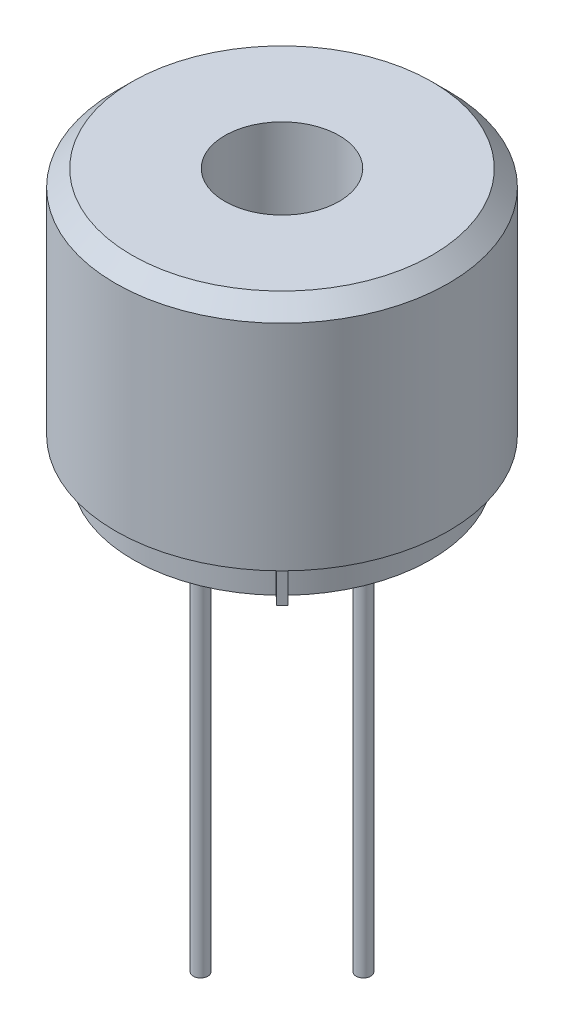
ISO-10303-21;
HEADER;
FILE_DESCRIPTION(('STEP AP214'),'2;1');
FILE_NAME('part.step','',(''),(''),'','','');
FILE_SCHEMA(('AUTOMOTIVE_DESIGN { 1 0 10303 214 1 1 1 1 }'));
ENDSEC;
DATA;
#1=APPLICATION_CONTEXT('core data for automotive mechanical design processes');
#2=APPLICATION_PROTOCOL_DEFINITION('international standard','automotive_design',2000,#1);
#3=PRODUCT_CONTEXT('',#1,'mechanical');
#4=PRODUCT('Part','Part','',(#3));
#5=PRODUCT_RELATED_PRODUCT_CATEGORY('part','',(#4));
#6=PRODUCT_DEFINITION_FORMATION('','',#4);
#7=PRODUCT_DEFINITION_CONTEXT('part definition',#1,'design');
#8=PRODUCT_DEFINITION('design','',#6,#7);
#9=PRODUCT_DEFINITION_SHAPE('','',#8);
#10=(LENGTH_UNIT() NAMED_UNIT(*) SI_UNIT(.MILLI.,.METRE.));
#11=(NAMED_UNIT(*) PLANE_ANGLE_UNIT() SI_UNIT($,.RADIAN.));
#12=(NAMED_UNIT(*) SI_UNIT($,.STERADIAN.) SOLID_ANGLE_UNIT());
#13=UNCERTAINTY_MEASURE_WITH_UNIT(LENGTH_MEASURE(1.E-05),#10,'distance_accuracy_value','');
#14=(GEOMETRIC_REPRESENTATION_CONTEXT(3) GLOBAL_UNCERTAINTY_ASSIGNED_CONTEXT((#13)) GLOBAL_UNIT_ASSIGNED_CONTEXT((#10,
#11,#12)) REPRESENTATION_CONTEXT('',''));
#15=CARTESIAN_POINT('',(0.,0.,0.));
#16=DIRECTION('',(0.,0.,1.));
#17=DIRECTION('',(1.,0.,0.));
#18=AXIS2_PLACEMENT_3D('',#15,#16,#17);
#19=CARTESIAN_POINT('',(0.,-7.07,0.));
#20=DIRECTION('',(0.,1.,0.));
#21=DIRECTION('',(0.,0.,1.));
#22=AXIS2_PLACEMENT_3D('',#19,#20,#21);
#23=CYLINDRICAL_SURFACE('',#22,5.1);
#24=CARTESIAN_POINT('',(0.,-0.5,0.));
#25=DIRECTION('',(0.,1.,0.));
#26=DIRECTION('',(0.,0.,1.));
#27=AXIS2_PLACEMENT_3D('',#24,#25,#26);
#28=CIRCLE('',#27,5.1);
#29=CARTESIAN_POINT('',(0.,-0.500000000000001,5.1));
#30=VERTEX_POINT('',#29);
#31=EDGE_CURVE('E62',#30,#30,#28,.F.);
#32=CARTESIAN_POINT('',(0.,-7.07,0.));
#33=DIRECTION('',(0.,1.,0.));
#34=DIRECTION('',(0.,0.,1.));
#35=AXIS2_PLACEMENT_3D('',#32,#33,#34);
#36=CIRCLE('',#35,5.1);
#37=CARTESIAN_POINT('',(0.,-7.07,5.1));
#38=VERTEX_POINT('',#37);
#39=EDGE_CURVE('E171',#38,#38,#36,.T.);
#40=CARTESIAN_POINT('',(0.,-0.500000000000001,5.1));
#41=CARTESIAN_POINT('',(0.,-0.568437500000001,5.1));
#42=CARTESIAN_POINT('',(0.,-0.636875000000001,5.1));
#43=CARTESIAN_POINT('',(0.,-0.773750000000001,5.1));
#44=CARTESIAN_POINT('',(0.,-0.842187500000002,5.1));
#45=CARTESIAN_POINT('',(0.,-0.979062500000002,5.1));
#46=CARTESIAN_POINT('',(0.,-1.0475,5.1));
#47=CARTESIAN_POINT('',(0.,-1.184375,5.1));
#48=CARTESIAN_POINT('',(0.,-1.2528125,5.1));
#49=CARTESIAN_POINT('',(0.,-1.3896875,5.1));
#50=CARTESIAN_POINT('',(0.,-1.458125,5.1));
#51=CARTESIAN_POINT('',(0.,-1.595,5.1));
#52=CARTESIAN_POINT('',(0.,-1.6634375,5.1));
#53=CARTESIAN_POINT('',(0.,-1.8003125,5.1));
#54=CARTESIAN_POINT('',(0.,-1.86875,5.1));
#55=CARTESIAN_POINT('',(0.,-2.005625,5.1));
#56=CARTESIAN_POINT('',(0.,-2.0740625,5.1));
#57=CARTESIAN_POINT('',(0.,-2.2109375,5.1));
#58=CARTESIAN_POINT('',(0.,-2.279375,5.1));
#59=CARTESIAN_POINT('',(0.,-2.41625,5.1));
#60=CARTESIAN_POINT('',(0.,-2.4846875,5.1));
#61=CARTESIAN_POINT('',(0.,-2.6215625,5.1));
#62=CARTESIAN_POINT('',(0.,-2.69,5.1));
#63=CARTESIAN_POINT('',(0.,-2.826875,5.1));
#64=CARTESIAN_POINT('',(0.,-2.8953125,5.1));
#65=CARTESIAN_POINT('',(0.,-3.0321875,5.1));
#66=CARTESIAN_POINT('',(0.,-3.100625,5.1));
#67=CARTESIAN_POINT('',(0.,-3.2375,5.1));
#68=CARTESIAN_POINT('',(0.,-3.3059375,5.1));
#69=CARTESIAN_POINT('',(0.,-3.4428125,5.1));
#70=CARTESIAN_POINT('',(0.,-3.51125,5.1));
#71=CARTESIAN_POINT('',(0.,-3.648125,5.1));
#72=CARTESIAN_POINT('',(0.,-3.7165625,5.1));
#73=CARTESIAN_POINT('',(0.,-3.8534375,5.1));
#74=CARTESIAN_POINT('',(0.,-3.921875,5.1));
#75=CARTESIAN_POINT('',(0.,-4.05875,5.1));
#76=CARTESIAN_POINT('',(0.,-4.1271875,5.1));
#77=CARTESIAN_POINT('',(0.,-4.2640625,5.1));
#78=CARTESIAN_POINT('',(0.,-4.3325,5.1));
#79=CARTESIAN_POINT('',(0.,-4.469375,5.1));
#80=CARTESIAN_POINT('',(0.,-4.5378125,5.1));
#81=CARTESIAN_POINT('',(0.,-4.6746875,5.1));
#82=CARTESIAN_POINT('',(0.,-4.743125,5.1));
#83=CARTESIAN_POINT('',(0.,-4.88,5.1));
#84=CARTESIAN_POINT('',(0.,-4.9484375,5.1));
#85=CARTESIAN_POINT('',(0.,-5.0853125,5.1));
#86=CARTESIAN_POINT('',(0.,-5.15375,5.1));
#87=CARTESIAN_POINT('',(0.,-5.290625,5.1));
#88=CARTESIAN_POINT('',(0.,-5.3590625,5.1));
#89=CARTESIAN_POINT('',(0.,-5.4959375,5.1));
#90=CARTESIAN_POINT('',(0.,-5.564375,5.1));
#91=CARTESIAN_POINT('',(0.,-5.70125,5.1));
#92=CARTESIAN_POINT('',(0.,-5.7696875,5.1));
#93=CARTESIAN_POINT('',(0.,-5.9065625,5.1));
#94=CARTESIAN_POINT('',(0.,-5.975,5.1));
#95=CARTESIAN_POINT('',(0.,-6.111875,5.1));
#96=CARTESIAN_POINT('',(0.,-6.1803125,5.1));
#97=CARTESIAN_POINT('',(0.,-6.3171875,5.1));
#98=CARTESIAN_POINT('',(0.,-6.385625,5.1));
#99=CARTESIAN_POINT('',(0.,-6.5225,5.1));
#100=CARTESIAN_POINT('',(0.,-6.5909375,5.1));
#101=CARTESIAN_POINT('',(0.,-6.7278125,5.1));
#102=CARTESIAN_POINT('',(0.,-6.79625,5.1));
#103=CARTESIAN_POINT('',(0.,-6.933125,5.1));
#104=CARTESIAN_POINT('',(0.,-7.0015625,5.1));
#105=CARTESIAN_POINT('',(0.,-7.07,5.1));
#106=B_SPLINE_CURVE_WITH_KNOTS('',3,(#40,#41,#42,#43,#44,#45,#46,#47,#48,#49,#50,#51,#52,#53,
#54,#55,#56,#57,#58,#59,#60,#61,#62,#63,#64,#65,#66,#67,#68,#69,#70,#71,#72,#73,#74,#75,#76,#77,
#78,#79,#80,#81,#82,#83,#84,#85,#86,#87,#88,#89,#90,#91,#92,#93,#94,#95,#96,#97,#98,#99,#100,
#101,#102,#103,#104,#105),.UNSPECIFIED.,.F.,.F.,(4,2,2,2,2,2,2,2,2,2,2,2,2,2,2,2,2,2,2,2,2,2,2,
2,2,2,2,2,2,2,2,2,4),(0.,0.2053125,0.410625,0.6159375,0.82125,1.0265625,1.231875,1.4371875,
1.6425,1.8478125,2.053125,2.2584375,2.46375,2.6690625,2.874375,3.0796875,3.285,3.4903125,
3.695625,3.9009375,4.10625,4.3115625,4.516875,4.7221875,4.9275,5.1328125,5.338125,5.5434375,
5.74875,5.9540625,6.159375,6.3646875,6.57),.UNSPECIFIED.);
#107=EDGE_CURVE('BSEAM53',#30,#38,#106,.T.);
#108=ORIENTED_EDGE('',*,*,#31,.T.);
#109=ORIENTED_EDGE('',*,*,#39,.T.);
#110=ORIENTED_EDGE('',*,*,#107,.T.);
#111=ORIENTED_EDGE('',*,*,#107,.F.);
#112=EDGE_LOOP('',(#108,#110,#109,#111));
#113=FACE_BOUND('',#112,.T.);
#114=ADVANCED_FACE('F53',(#113),#23,.T.);
#115=CARTESIAN_POINT('',(0.,-7.07,0.));
#116=DIRECTION('',(0.,1.,0.));
#117=DIRECTION('',(0.,0.,1.));
#118=AXIS2_PLACEMENT_3D('',#115,#116,#117);
#119=PLANE('',#118);
#120=DIRECTION('',(0.693252976854918,0.,-0.720694324996246));
#121=VECTOR('',#120,1.);
#122=CARTESIAN_POINT('',(3.56086986068658,-7.07,3.42528523604898));
#123=LINE('',#122,#121);
#124=CARTESIAN_POINT('',(3.41228418067474,-7.07,3.57975245066672));
#125=VERTEX_POINT('',#124);
#126=CARTESIAN_POINT('',(3.58677461982361,-7.07,3.39835507703955));
#127=VERTEX_POINT('',#126);
#128=EDGE_CURVE('E110',#125,#127,#123,.T.);
#129=ORIENTED_EDGE('',*,*,#128,.T.);
#130=DIRECTION('',(0.720694324996246,0.,0.693252976854918));
#131=VECTOR('',#130,1.);
#132=CARTESIAN_POINT('',(0.0259047591370399,-7.07,-0.0269301590094238));
#133=LINE('',#132,#131);
#134=CARTESIAN_POINT('',(3.31216053954314,-7.07,3.13419727526735));
#135=VERTEX_POINT('',#134);
#136=EDGE_CURVE('E96',#135,#127,#133,.T.);
#137=ORIENTED_EDGE('',*,*,#136,.F.);
#138=CARTESIAN_POINT('',(0.,-7.07,0.));
#139=DIRECTION('',(0.,-1.,0.));
#140=DIRECTION('',(0.,0.,-1.));
#141=AXIS2_PLACEMENT_3D('',#138,#139,#140);
#142=CIRCLE('',#141,4.56);
#143=CARTESIAN_POINT('',(3.13414826707024,-7.07,3.3122069138296));
#144=VERTEX_POINT('',#143);
#145=EDGE_CURVE('E14',#144,#135,#142,.T.);
#146=ORIENTED_EDGE('',*,*,#145,.F.);
#147=DIRECTION('',(0.720694324996246,0.,0.693252976854918));
#148=VECTOR('',#147,1.);
#149=CARTESIAN_POINT('',(-0.148585680011836,-7.07,0.154467214617744));
#150=LINE('',#149,#148);
#151=EDGE_CURVE('E116',#144,#125,#150,.T.);
#152=ORIENTED_EDGE('',*,*,#151,.T.);
#153=EDGE_LOOP('',(#129,#137,#146,#152));
#154=FACE_BOUND('',#153,.T.);
#155=ORIENTED_EDGE('',*,*,#39,.F.);
#156=EDGE_LOOP('',(#155));
#157=FACE_BOUND('',#156,.T.);
#158=ADVANCED_FACE('F114',(#154,#157),#119,.F.);
#159=CARTESIAN_POINT('',(0.,0.,0.));
#160=DIRECTION('',(0.,1.,0.));
#161=DIRECTION('',(0.,0.,1.));
#162=AXIS2_PLACEMENT_3D('',#159,#160,#161);
#163=PLANE('',#162);
#164=CARTESIAN_POINT('',(0.,0.,0.));
#165=DIRECTION('',(0.,1.,0.));
#166=DIRECTION('',(0.,0.,1.));
#167=AXIS2_PLACEMENT_3D('',#164,#165,#166);
#168=CIRCLE('',#167,4.6);
#169=CARTESIAN_POINT('',(0.,0.,4.6));
#170=VERTEX_POINT('',#169);
#171=EDGE_CURVE('E174',#170,#170,#168,.T.);
#172=ORIENTED_EDGE('',*,*,#171,.T.);
#173=EDGE_LOOP('',(#172));
#174=FACE_BOUND('',#173,.T.);
#175=CARTESIAN_POINT('',(0.,0.,0.));
#176=DIRECTION('',(0.,1.,0.));
#177=DIRECTION('',(0.,0.,1.));
#178=AXIS2_PLACEMENT_3D('',#175,#176,#177);
#179=CIRCLE('',#178,1.75);
#180=CARTESIAN_POINT('',(0.,0.,1.75));
#181=VERTEX_POINT('',#180);
#182=EDGE_CURVE('E158',#181,#181,#179,.T.);
#183=ORIENTED_EDGE('',*,*,#182,.F.);
#184=EDGE_LOOP('',(#183));
#185=FACE_BOUND('',#184,.T.);
#186=ADVANCED_FACE('F218',(#174,#185),#163,.T.);
#187=CARTESIAN_POINT('',(0.,-4.,0.));
#188=DIRECTION('',(0.,1.,0.));
#189=DIRECTION('',(0.,0.,1.));
#190=AXIS2_PLACEMENT_3D('',#187,#188,#189);
#191=CYLINDRICAL_SURFACE('',#190,1.75);
#192=CARTESIAN_POINT('',(0.,-4.,0.));
#193=DIRECTION('',(0.,1.,0.));
#194=DIRECTION('',(0.,0.,1.));
#195=AXIS2_PLACEMENT_3D('',#192,#193,#194);
#196=CIRCLE('',#195,1.75);
#197=CARTESIAN_POINT('',(0.,-4.,1.75));
#198=VERTEX_POINT('',#197);
#199=EDGE_CURVE('E163',#198,#198,#196,.T.);
#200=ORIENTED_EDGE('',*,*,#199,.F.);
#201=EDGE_LOOP('',(#200));
#202=FACE_BOUND('',#201,.T.);
#203=ORIENTED_EDGE('',*,*,#182,.T.);
#204=EDGE_LOOP('',(#203));
#205=FACE_BOUND('',#204,.T.);
#206=ADVANCED_FACE('F223',(#202,#205),#191,.F.);
#207=CARTESIAN_POINT('',(0.,-4.,0.));
#208=DIRECTION('',(0.,1.,0.));
#209=DIRECTION('',(0.,0.,1.));
#210=AXIS2_PLACEMENT_3D('',#207,#208,#209);
#211=PLANE('',#210);
#212=CARTESIAN_POINT('',(0.,-4.,0.));
#213=DIRECTION('',(0.,1.,0.));
#214=DIRECTION('',(0.,0.,1.));
#215=AXIS2_PLACEMENT_3D('',#212,#213,#214);
#216=CIRCLE('',#215,0.75);
#217=CARTESIAN_POINT('',(0.,-4.,0.75));
#218=VERTEX_POINT('',#217);
#219=EDGE_CURVE('E160',#218,#218,#216,.T.);
#220=ORIENTED_EDGE('',*,*,#219,.F.);
#221=EDGE_LOOP('',(#220));
#222=FACE_BOUND('',#221,.T.);
#223=ORIENTED_EDGE('',*,*,#199,.T.);
#224=EDGE_LOOP('',(#223));
#225=FACE_BOUND('',#224,.T.);
#226=ADVANCED_FACE('F233',(#222,#225),#211,.T.);
#227=CARTESIAN_POINT('',(0.,-5.74,0.));
#228=DIRECTION('',(0.,1.,0.));
#229=DIRECTION('',(0.,0.,1.));
#230=AXIS2_PLACEMENT_3D('',#227,#228,#229);
#231=PLANE('',#230);
#232=CARTESIAN_POINT('',(0.,-5.74,0.));
#233=DIRECTION('',(0.,1.,0.));
#234=DIRECTION('',(0.,0.,1.));
#235=AXIS2_PLACEMENT_3D('',#232,#233,#234);
#236=CIRCLE('',#235,0.75);
#237=CARTESIAN_POINT('',(0.,-5.74,0.75));
#238=VERTEX_POINT('',#237);
#239=EDGE_CURVE('E166',#238,#238,#236,.T.);
#240=ORIENTED_EDGE('',*,*,#239,.T.);
#241=EDGE_LOOP('',(#240));
#242=FACE_BOUND('',#241,.T.);
#243=ADVANCED_FACE('F229',(#242),#231,.T.);
#244=CARTESIAN_POINT('',(0.,-5.74,0.));
#245=DIRECTION('',(0.,1.,0.));
#246=DIRECTION('',(0.,0.,1.));
#247=AXIS2_PLACEMENT_3D('',#244,#245,#246);
#248=CYLINDRICAL_SURFACE('',#247,0.75);
#249=ORIENTED_EDGE('',*,*,#239,.F.);
#250=EDGE_LOOP('',(#249));
#251=FACE_BOUND('',#250,.T.);
#252=ORIENTED_EDGE('',*,*,#219,.T.);
#253=EDGE_LOOP('',(#252));
#254=FACE_BOUND('',#253,.T.);
#255=ADVANCED_FACE('F226',(#251,#254),#248,.F.);
#256=CARTESIAN_POINT('',(0.,0.,0.));
#257=DIRECTION('',(0.,-1.,0.));
#258=DIRECTION('',(0.,0.,-1.));
#259=AXIS2_PLACEMENT_3D('',#256,#257,#258);
#260=CONICAL_SURFACE('',#259,4.6,0.785398163397445);
#261=ORIENTED_EDGE('',*,*,#31,.F.);
#262=EDGE_LOOP('',(#261));
#263=FACE_BOUND('',#262,.T.);
#264=ORIENTED_EDGE('',*,*,#171,.F.);
#265=EDGE_LOOP('',(#264));
#266=FACE_BOUND('',#265,.T.);
#267=ADVANCED_FACE('F55',(#263,#266),#260,.T.);
#268=CARTESIAN_POINT('',(0.,-8.1,0.));
#269=DIRECTION('',(0.,1.,0.));
#270=DIRECTION('',(0.,0.,1.));
#271=AXIS2_PLACEMENT_3D('',#268,#269,#270);
#272=CYLINDRICAL_SURFACE('',#271,4.56);
#273=ORIENTED_EDGE('',*,*,#145,.T.);
#274=DIRECTION('',(0.,-1.,0.));
#275=VECTOR('',#274,1.);
#276=CARTESIAN_POINT('',(3.31216053954314,-6.43487006877963,3.13419727526735));
#277=LINE('',#276,#275);
#278=CARTESIAN_POINT('',(3.31216053954314,-8.1,3.13419727526735));
#279=VERTEX_POINT('',#278);
#280=EDGE_CURVE('E102',#135,#279,#277,.T.);
#281=ORIENTED_EDGE('',*,*,#280,.T.);
#282=CARTESIAN_POINT('',(0.,-8.1,0.));
#283=DIRECTION('',(0.,-1.,0.));
#284=DIRECTION('',(0.,0.,-1.));
#285=AXIS2_PLACEMENT_3D('',#282,#283,#284);
#286=CIRCLE('',#285,4.56);
#287=CARTESIAN_POINT('',(3.13414826707024,-8.1,3.3122069138296));
#288=VERTEX_POINT('',#287);
#289=EDGE_CURVE('E157',#288,#279,#286,.T.);
#290=ORIENTED_EDGE('',*,*,#289,.F.);
#291=DIRECTION('',(0.,-1.,0.));
#292=VECTOR('',#291,1.);
#293=CARTESIAN_POINT('',(3.13414826707024,-6.43487006877963,3.3122069138296));
#294=LINE('',#293,#292);
#295=EDGE_CURVE('E126',#144,#288,#294,.T.);
#296=ORIENTED_EDGE('',*,*,#295,.F.);
#297=EDGE_LOOP('',(#273,#281,#290,#296));
#298=FACE_BOUND('',#297,.T.);
#299=ADVANCED_FACE('F241',(#298),#272,.T.);
#300=CARTESIAN_POINT('',(0.,-8.1,0.));
#301=DIRECTION('',(0.,-1.,0.));
#302=DIRECTION('',(0.,0.,-1.));
#303=AXIS2_PLACEMENT_3D('',#300,#301,#302);
#304=PLANE('',#303);
#305=CARTESIAN_POINT('',(-2.49463280478679,-8.1,0.));
#306=DIRECTION('',(0.,-1.,0.));
#307=DIRECTION('',(0.,0.,-1.));
#308=AXIS2_PLACEMENT_3D('',#305,#306,#307);
#309=CIRCLE('',#308,0.8);
#310=CARTESIAN_POINT('',(-2.49463280478679,-8.1,-0.799999999999974));
#311=VERTEX_POINT('',#310);
#312=EDGE_CURVE('E144',#311,#311,#309,.F.);
#313=ORIENTED_EDGE('',*,*,#312,.T.);
#314=EDGE_LOOP('',(#313));
#315=FACE_BOUND('',#314,.T.);
#316=CARTESIAN_POINT('',(0.,-8.1,-2.49463280478679));
#317=DIRECTION('',(0.,-1.,0.));
#318=DIRECTION('',(0.,0.,-1.));
#319=AXIS2_PLACEMENT_3D('',#316,#317,#318);
#320=CIRCLE('',#319,0.8);
#321=CARTESIAN_POINT('',(0.,-8.1,-3.29463280478679));
#322=VERTEX_POINT('',#321);
#323=EDGE_CURVE('E148',#322,#322,#320,.F.);
#324=ORIENTED_EDGE('',*,*,#323,.T.);
#325=EDGE_LOOP('',(#324));
#326=FACE_BOUND('',#325,.T.);
#327=CARTESIAN_POINT('',(2.49463280478679,-8.1,0.));
#328=DIRECTION('',(0.,-1.,0.));
#329=DIRECTION('',(0.,0.,-1.));
#330=AXIS2_PLACEMENT_3D('',#327,#328,#329);
#331=CIRCLE('',#330,0.8);
#332=CARTESIAN_POINT('',(2.49463280478679,-8.1,-0.800000000000009));
#333=VERTEX_POINT('',#332);
#334=EDGE_CURVE('E152',#333,#333,#331,.F.);
#335=ORIENTED_EDGE('',*,*,#334,.T.);
#336=EDGE_LOOP('',(#335));
#337=FACE_BOUND('',#336,.T.);
#338=CARTESIAN_POINT('',(0.,-8.1,2.49463280478679));
#339=DIRECTION('',(0.,-1.,0.));
#340=DIRECTION('',(0.,0.,-1.));
#341=AXIS2_PLACEMENT_3D('',#338,#339,#340);
#342=CIRCLE('',#341,0.8);
#343=CARTESIAN_POINT('',(0.,-8.1,1.69463280478679));
#344=VERTEX_POINT('',#343);
#345=EDGE_CURVE('E156',#344,#344,#342,.F.);
#346=ORIENTED_EDGE('',*,*,#345,.T.);
#347=EDGE_LOOP('',(#346));
#348=FACE_BOUND('',#347,.T.);
#349=ORIENTED_EDGE('',*,*,#289,.T.);
#350=DIRECTION('',(0.720694324996246,0.,0.693252976854918));
#351=VECTOR('',#350,1.);
#352=CARTESIAN_POINT('',(0.0259047591370399,-8.1,-0.0269301590094238));
#353=LINE('',#352,#351);
#354=CARTESIAN_POINT('',(3.58677461982361,-8.1,3.39835507703955));
#355=VERTEX_POINT('',#354);
#356=EDGE_CURVE('E121',#279,#355,#353,.T.);
#357=ORIENTED_EDGE('',*,*,#356,.T.);
#358=DIRECTION('',(0.693252976854918,0.,-0.720694324996246));
#359=VECTOR('',#358,1.);
#360=CARTESIAN_POINT('',(3.56086986068658,-8.1,3.42528523604898));
#361=LINE('',#360,#359);
#362=CARTESIAN_POINT('',(3.41228418067474,-8.1,3.57975245066672));
#363=VERTEX_POINT('',#362);
#364=EDGE_CURVE('E106',#363,#355,#361,.T.);
#365=ORIENTED_EDGE('',*,*,#364,.F.);
#366=DIRECTION('',(0.720694324996246,0.,0.693252976854918));
#367=VECTOR('',#366,1.);
#368=CARTESIAN_POINT('',(-0.148585680011836,-8.1,0.154467214617744));
#369=LINE('',#368,#367);
#370=EDGE_CURVE('E70',#288,#363,#369,.T.);
#371=ORIENTED_EDGE('',*,*,#370,.F.);
#372=EDGE_LOOP('',(#349,#357,#365,#371));
#373=FACE_BOUND('',#372,.T.);
#374=ADVANCED_FACE('F244',(#315,#326,#337,#348,#373),#304,.T.);
#375=CARTESIAN_POINT('',(0.,-8.17,2.49463280478679));
#376=DIRECTION('',(0.,1.,0.));
#377=DIRECTION('',(0.,0.,1.));
#378=AXIS2_PLACEMENT_3D('',#375,#376,#377);
#379=CYLINDRICAL_SURFACE('',#378,0.8);
#380=ORIENTED_EDGE('',*,*,#345,.F.);
#381=EDGE_LOOP('',(#380));
#382=FACE_BOUND('',#381,.T.);
#383=CARTESIAN_POINT('',(0.,-8.17,2.49463280478679));
#384=DIRECTION('',(0.,-1.,0.));
#385=DIRECTION('',(0.,0.,-1.));
#386=AXIS2_PLACEMENT_3D('',#383,#384,#385);
#387=CIRCLE('',#386,0.8);
#388=CARTESIAN_POINT('',(0.,-8.17,1.69463280478679));
#389=VERTEX_POINT('',#388);
#390=EDGE_CURVE('E153',#389,#389,#387,.T.);
#391=ORIENTED_EDGE('',*,*,#390,.F.);
#392=EDGE_LOOP('',(#391));
#393=FACE_BOUND('',#392,.T.);
#394=ADVANCED_FACE('F248',(#382,#393),#379,.T.);
#395=CARTESIAN_POINT('',(0.,-8.17,0.));
#396=DIRECTION('',(0.,-1.,0.));
#397=DIRECTION('',(0.,0.,-1.));
#398=AXIS2_PLACEMENT_3D('',#395,#396,#397);
#399=PLANE('',#398);
#400=CARTESIAN_POINT('',(0.,-8.17,2.49463280478679));
#401=DIRECTION('',(0.,-1.,0.));
#402=DIRECTION('',(0.,0.,-1.));
#403=AXIS2_PLACEMENT_3D('',#400,#401,#402);
#404=CIRCLE('',#403,0.225);
#405=CARTESIAN_POINT('',(0.,-8.17,2.26963280478679));
#406=VERTEX_POINT('',#405);
#407=EDGE_CURVE('E136',#406,#406,#404,.F.);
#408=ORIENTED_EDGE('',*,*,#407,.T.);
#409=EDGE_LOOP('',(#408));
#410=FACE_BOUND('',#409,.T.);
#411=ORIENTED_EDGE('',*,*,#390,.T.);
#412=EDGE_LOOP('',(#411));
#413=FACE_BOUND('',#412,.T.);
#414=ADVANCED_FACE('F252',(#410,#413),#399,.T.);
#415=CARTESIAN_POINT('',(2.49463280478679,-8.17,0.));
#416=DIRECTION('',(0.,1.,0.));
#417=DIRECTION('',(0.,0.,1.));
#418=AXIS2_PLACEMENT_3D('',#415,#416,#417);
#419=CYLINDRICAL_SURFACE('',#418,0.8);
#420=ORIENTED_EDGE('',*,*,#334,.F.);
#421=EDGE_LOOP('',(#420));
#422=FACE_BOUND('',#421,.T.);
#423=CARTESIAN_POINT('',(2.49463280478679,-8.17,0.));
#424=DIRECTION('',(0.,-1.,0.));
#425=DIRECTION('',(0.,0.,-1.));
#426=AXIS2_PLACEMENT_3D('',#423,#424,#425);
#427=CIRCLE('',#426,0.8);
#428=CARTESIAN_POINT('',(2.49463280478679,-8.17,-0.800000000000009));
#429=VERTEX_POINT('',#428);
#430=EDGE_CURVE('E149',#429,#429,#427,.T.);
#431=ORIENTED_EDGE('',*,*,#430,.F.);
#432=EDGE_LOOP('',(#431));
#433=FACE_BOUND('',#432,.T.);
#434=ADVANCED_FACE('F256',(#422,#433),#419,.T.);
#435=CARTESIAN_POINT('',(0.,-8.17,0.));
#436=DIRECTION('',(0.,-1.,0.));
#437=DIRECTION('',(0.,0.,-1.));
#438=AXIS2_PLACEMENT_3D('',#435,#436,#437);
#439=PLANE('',#438);
#440=CARTESIAN_POINT('',(2.49463280478679,-8.17,0.));
#441=DIRECTION('',(0.,-1.,0.));
#442=DIRECTION('',(0.,0.,-1.));
#443=AXIS2_PLACEMENT_3D('',#440,#441,#442);
#444=CIRCLE('',#443,0.225);
#445=CARTESIAN_POINT('',(2.49463280478679,-8.17,-0.225000000000009));
#446=VERTEX_POINT('',#445);
#447=EDGE_CURVE('E132',#446,#446,#444,.F.);
#448=ORIENTED_EDGE('',*,*,#447,.T.);
#449=EDGE_LOOP('',(#448));
#450=FACE_BOUND('',#449,.T.);
#451=ORIENTED_EDGE('',*,*,#430,.T.);
#452=EDGE_LOOP('',(#451));
#453=FACE_BOUND('',#452,.T.);
#454=ADVANCED_FACE('F193',(#450,#453),#439,.T.);
#455=CARTESIAN_POINT('',(0.,-8.17,-2.49463280478679));
#456=DIRECTION('',(0.,1.,0.));
#457=DIRECTION('',(0.,0.,1.));
#458=AXIS2_PLACEMENT_3D('',#455,#456,#457);
#459=CYLINDRICAL_SURFACE('',#458,0.8);
#460=ORIENTED_EDGE('',*,*,#323,.F.);
#461=EDGE_LOOP('',(#460));
#462=FACE_BOUND('',#461,.T.);
#463=CARTESIAN_POINT('',(0.,-8.17,-2.49463280478679));
#464=DIRECTION('',(0.,-1.,0.));
#465=DIRECTION('',(0.,0.,-1.));
#466=AXIS2_PLACEMENT_3D('',#463,#464,#465);
#467=CIRCLE('',#466,0.8);
#468=CARTESIAN_POINT('',(0.,-8.17,-3.29463280478679));
#469=VERTEX_POINT('',#468);
#470=EDGE_CURVE('E145',#469,#469,#467,.T.);
#471=ORIENTED_EDGE('',*,*,#470,.F.);
#472=EDGE_LOOP('',(#471));
#473=FACE_BOUND('',#472,.T.);
#474=ADVANCED_FACE('F260',(#462,#473),#459,.T.);
#475=CARTESIAN_POINT('',(0.,-8.17,0.));
#476=DIRECTION('',(0.,-1.,0.));
#477=DIRECTION('',(0.,0.,-1.));
#478=AXIS2_PLACEMENT_3D('',#475,#476,#477);
#479=PLANE('',#478);
#480=CARTESIAN_POINT('',(0.,-8.17,-2.49463280478679));
#481=DIRECTION('',(0.,-1.,0.));
#482=DIRECTION('',(0.,0.,-1.));
#483=AXIS2_PLACEMENT_3D('',#480,#481,#482);
#484=CIRCLE('',#483,0.225);
#485=CARTESIAN_POINT('',(0.,-8.17,-2.71963280478679));
#486=VERTEX_POINT('',#485);
#487=EDGE_CURVE('E57',#486,#486,#484,.F.);
#488=ORIENTED_EDGE('',*,*,#487,.T.);
#489=EDGE_LOOP('',(#488));
#490=FACE_BOUND('',#489,.T.);
#491=ORIENTED_EDGE('',*,*,#470,.T.);
#492=EDGE_LOOP('',(#491));
#493=FACE_BOUND('',#492,.T.);
#494=ADVANCED_FACE('F264',(#490,#493),#479,.T.);
#495=CARTESIAN_POINT('',(0.,-8.17,0.));
#496=DIRECTION('',(0.,-1.,0.));
#497=DIRECTION('',(0.,0.,-1.));
#498=AXIS2_PLACEMENT_3D('',#495,#496,#497);
#499=PLANE('',#498);
#500=CARTESIAN_POINT('',(-2.49463280478679,-8.17,0.));
#501=DIRECTION('',(0.,-1.,0.));
#502=DIRECTION('',(0.,0.,-1.));
#503=AXIS2_PLACEMENT_3D('',#500,#501,#502);
#504=CIRCLE('',#503,0.225);
#505=CARTESIAN_POINT('',(-2.49463280478679,-8.17,-0.224999999999974));
#506=VERTEX_POINT('',#505);
#507=EDGE_CURVE('E140',#506,#506,#504,.F.);
#508=ORIENTED_EDGE('',*,*,#507,.T.);
#509=EDGE_LOOP('',(#508));
#510=FACE_BOUND('',#509,.T.);
#511=CARTESIAN_POINT('',(-2.49463280478679,-8.17,0.));
#512=DIRECTION('',(0.,-1.,0.));
#513=DIRECTION('',(0.,0.,-1.));
#514=AXIS2_PLACEMENT_3D('',#511,#512,#513);
#515=CIRCLE('',#514,0.8);
#516=CARTESIAN_POINT('',(-2.49463280478679,-8.17,-0.799999999999974));
#517=VERTEX_POINT('',#516);
#518=EDGE_CURVE('E141',#517,#517,#515,.T.);
#519=ORIENTED_EDGE('',*,*,#518,.T.);
#520=EDGE_LOOP('',(#519));
#521=FACE_BOUND('',#520,.T.);
#522=ADVANCED_FACE('F267',(#510,#521),#499,.T.);
#523=CARTESIAN_POINT('',(-2.49463280478679,-8.17,0.));
#524=DIRECTION('',(0.,1.,0.));
#525=DIRECTION('',(0.,0.,1.));
#526=AXIS2_PLACEMENT_3D('',#523,#524,#525);
#527=CYLINDRICAL_SURFACE('',#526,0.8);
#528=ORIENTED_EDGE('',*,*,#312,.F.);
#529=EDGE_LOOP('',(#528));
#530=FACE_BOUND('',#529,.T.);
#531=ORIENTED_EDGE('',*,*,#518,.F.);
#532=EDGE_LOOP('',(#531));
#533=FACE_BOUND('',#532,.T.);
#534=ADVANCED_FACE('F269',(#530,#533),#527,.T.);
#535=CARTESIAN_POINT('',(-2.49463280478679,-20.07,0.));
#536=DIRECTION('',(0.,1.,0.));
#537=DIRECTION('',(0.,0.,1.));
#538=AXIS2_PLACEMENT_3D('',#535,#536,#537);
#539=CYLINDRICAL_SURFACE('',#538,0.225);
#540=ORIENTED_EDGE('',*,*,#507,.F.);
#541=EDGE_LOOP('',(#540));
#542=FACE_BOUND('',#541,.T.);
#543=CARTESIAN_POINT('',(-2.49463280478679,-20.07,0.));
#544=DIRECTION('',(0.,-1.,0.));
#545=DIRECTION('',(0.,0.,-1.));
#546=AXIS2_PLACEMENT_3D('',#543,#544,#545);
#547=CIRCLE('',#546,0.225);
#548=CARTESIAN_POINT('',(-2.49463280478679,-20.07,-0.224999999999974));
#549=VERTEX_POINT('',#548);
#550=EDGE_CURVE('E137',#549,#549,#547,.T.);
#551=ORIENTED_EDGE('',*,*,#550,.F.);
#552=EDGE_LOOP('',(#551));
#553=FACE_BOUND('',#552,.T.);
#554=ADVANCED_FACE('F276',(#542,#553),#539,.T.);
#555=CARTESIAN_POINT('',(0.,-20.07,0.));
#556=DIRECTION('',(0.,-1.,0.));
#557=DIRECTION('',(0.,0.,-1.));
#558=AXIS2_PLACEMENT_3D('',#555,#556,#557);
#559=PLANE('',#558);
#560=ORIENTED_EDGE('',*,*,#550,.T.);
#561=EDGE_LOOP('',(#560));
#562=FACE_BOUND('',#561,.T.);
#563=ADVANCED_FACE('F282',(#562),#559,.T.);
#564=CARTESIAN_POINT('',(0.,-20.07,2.49463280478679));
#565=DIRECTION('',(0.,1.,0.));
#566=DIRECTION('',(0.,0.,1.));
#567=AXIS2_PLACEMENT_3D('',#564,#565,#566);
#568=CYLINDRICAL_SURFACE('',#567,0.225);
#569=ORIENTED_EDGE('',*,*,#407,.F.);
#570=EDGE_LOOP('',(#569));
#571=FACE_BOUND('',#570,.T.);
#572=CARTESIAN_POINT('',(0.,-20.07,2.49463280478679));
#573=DIRECTION('',(0.,-1.,0.));
#574=DIRECTION('',(0.,0.,-1.));
#575=AXIS2_PLACEMENT_3D('',#572,#573,#574);
#576=CIRCLE('',#575,0.225);
#577=CARTESIAN_POINT('',(0.,-20.07,2.26963280478679));
#578=VERTEX_POINT('',#577);
#579=EDGE_CURVE('E133',#578,#578,#576,.T.);
#580=ORIENTED_EDGE('',*,*,#579,.F.);
#581=EDGE_LOOP('',(#580));
#582=FACE_BOUND('',#581,.T.);
#583=ADVANCED_FACE('F286',(#571,#582),#568,.T.);
#584=CARTESIAN_POINT('',(0.,-20.07,0.));
#585=DIRECTION('',(0.,-1.,0.));
#586=DIRECTION('',(0.,0.,-1.));
#587=AXIS2_PLACEMENT_3D('',#584,#585,#586);
#588=PLANE('',#587);
#589=ORIENTED_EDGE('',*,*,#579,.T.);
#590=EDGE_LOOP('',(#589));
#591=FACE_BOUND('',#590,.T.);
#592=ADVANCED_FACE('F200',(#591),#588,.T.);
#593=CARTESIAN_POINT('',(2.49463280478679,-20.07,0.));
#594=DIRECTION('',(0.,1.,0.));
#595=DIRECTION('',(0.,0.,1.));
#596=AXIS2_PLACEMENT_3D('',#593,#594,#595);
#597=CYLINDRICAL_SURFACE('',#596,0.225);
#598=ORIENTED_EDGE('',*,*,#447,.F.);
#599=EDGE_LOOP('',(#598));
#600=FACE_BOUND('',#599,.T.);
#601=CARTESIAN_POINT('',(2.49463280478679,-20.07,0.));
#602=DIRECTION('',(0.,-1.,0.));
#603=DIRECTION('',(0.,0.,-1.));
#604=AXIS2_PLACEMENT_3D('',#601,#602,#603);
#605=CIRCLE('',#604,0.225);
#606=CARTESIAN_POINT('',(2.49463280478679,-20.07,-0.225000000000009));
#607=VERTEX_POINT('',#606);
#608=EDGE_CURVE('E129',#607,#607,#605,.T.);
#609=ORIENTED_EDGE('',*,*,#608,.F.);
#610=EDGE_LOOP('',(#609));
#611=FACE_BOUND('',#610,.T.);
#612=ADVANCED_FACE('F196',(#600,#611),#597,.T.);
#613=CARTESIAN_POINT('',(0.,-20.07,0.));
#614=DIRECTION('',(0.,-1.,0.));
#615=DIRECTION('',(0.,0.,-1.));
#616=AXIS2_PLACEMENT_3D('',#613,#614,#615);
#617=PLANE('',#616);
#618=ORIENTED_EDGE('',*,*,#608,.T.);
#619=EDGE_LOOP('',(#618));
#620=FACE_BOUND('',#619,.T.);
#621=ADVANCED_FACE('F199',(#620),#617,.T.);
#622=CARTESIAN_POINT('',(0.,-20.07,-2.49463280478679));
#623=DIRECTION('',(0.,1.,0.));
#624=DIRECTION('',(0.,0.,1.));
#625=AXIS2_PLACEMENT_3D('',#622,#623,#624);
#626=CYLINDRICAL_SURFACE('',#625,0.225);
#627=ORIENTED_EDGE('',*,*,#487,.F.);
#628=EDGE_LOOP('',(#627));
#629=FACE_BOUND('',#628,.T.);
#630=CARTESIAN_POINT('',(0.,-20.07,-2.49463280478679));
#631=DIRECTION('',(0.,-1.,0.));
#632=DIRECTION('',(0.,0.,-1.));
#633=AXIS2_PLACEMENT_3D('',#630,#631,#632);
#634=CIRCLE('',#633,0.225);
#635=CARTESIAN_POINT('',(0.,-20.07,-2.71963280478679));
#636=VERTEX_POINT('',#635);
#637=EDGE_CURVE('E117',#636,#636,#634,.T.);
#638=ORIENTED_EDGE('',*,*,#637,.F.);
#639=EDGE_LOOP('',(#638));
#640=FACE_BOUND('',#639,.T.);
#641=ADVANCED_FACE('F205',(#629,#640),#626,.T.);
#642=CARTESIAN_POINT('',(0.,-20.07,0.));
#643=DIRECTION('',(0.,-1.,0.));
#644=DIRECTION('',(0.,0.,-1.));
#645=AXIS2_PLACEMENT_3D('',#642,#643,#644);
#646=PLANE('',#645);
#647=ORIENTED_EDGE('',*,*,#637,.T.);
#648=EDGE_LOOP('',(#647));
#649=FACE_BOUND('',#648,.T.);
#650=ADVANCED_FACE('F210',(#649),#646,.T.);
#651=CARTESIAN_POINT('',(3.56086986068658,-6.43487006877963,3.42528523604898));
#652=DIRECTION('',(-0.720694324996246,0.,-0.693252976854917));
#653=DIRECTION('',(-0.693252976854918,0.,0.720694324996246));
#654=AXIS2_PLACEMENT_3D('',#651,#652,#653);
#655=PLANE('',#654);
#656=ORIENTED_EDGE('',*,*,#128,.F.);
#657=DIRECTION('',(0.,-1.,0.));
#658=VECTOR('',#657,1.);
#659=CARTESIAN_POINT('',(3.41228418067474,-6.43487006877963,3.57975245066672));
#660=LINE('',#659,#658);
#661=EDGE_CURVE('E77',#125,#363,#660,.T.);
#662=ORIENTED_EDGE('',*,*,#661,.T.);
#663=ORIENTED_EDGE('',*,*,#364,.T.);
#664=DIRECTION('',(0.,-1.,0.));
#665=VECTOR('',#664,1.);
#666=CARTESIAN_POINT('',(3.58677461982361,-6.43487006877963,3.39835507703955));
#667=LINE('',#666,#665);
#668=EDGE_CURVE('E99',#127,#355,#667,.T.);
#669=ORIENTED_EDGE('',*,*,#668,.F.);
#670=EDGE_LOOP('',(#656,#662,#663,#669));
#671=FACE_BOUND('',#670,.T.);
#672=ADVANCED_FACE('F109',(#671),#655,.F.);
#673=CARTESIAN_POINT('',(0.0259047591370399,-6.43487006877963,-0.0269301590094238));
#674=DIRECTION('',(0.693252976854918,0.,-0.720694324996246));
#675=DIRECTION('',(-0.720694324996246,0.,-0.693252976854918));
#676=AXIS2_PLACEMENT_3D('',#673,#674,#675);
#677=PLANE('',#676);
#678=ORIENTED_EDGE('',*,*,#280,.F.);
#679=ORIENTED_EDGE('',*,*,#136,.T.);
#680=ORIENTED_EDGE('',*,*,#668,.T.);
#681=ORIENTED_EDGE('',*,*,#356,.F.);
#682=EDGE_LOOP('',(#678,#679,#680,#681));
#683=FACE_BOUND('',#682,.T.);
#684=ADVANCED_FACE('F98',(#683),#677,.T.);
#685=CARTESIAN_POINT('',(-0.148585680011836,-6.43487006877963,0.154467214617744));
#686=DIRECTION('',(0.693252976854918,0.,-0.720694324996246));
#687=DIRECTION('',(-0.720694324996246,0.,-0.693252976854918));
#688=AXIS2_PLACEMENT_3D('',#685,#686,#687);
#689=PLANE('',#688);
#690=ORIENTED_EDGE('',*,*,#151,.F.);
#691=ORIENTED_EDGE('',*,*,#295,.T.);
#692=ORIENTED_EDGE('',*,*,#370,.T.);
#693=ORIENTED_EDGE('',*,*,#661,.F.);
#694=EDGE_LOOP('',(#690,#691,#692,#693));
#695=FACE_BOUND('',#694,.T.);
#696=ADVANCED_FACE('F365',(#695),#689,.F.);
#697=CLOSED_SHELL('',(#114,#158,#186,#206,#226,#243,#255,#267,#299,#374,#394,#414,#434,#454,
#474,#494,#522,#534,#554,#563,#583,#592,#612,#621,#641,#650,#672,#684,#696));
#698=MANIFOLD_SOLID_BREP('B2',#697);
#699=ADVANCED_BREP_SHAPE_REPRESENTATION('',(#18,#698),#14);
#700=SHAPE_DEFINITION_REPRESENTATION(#9,#699);
ENDSEC;
END-ISO-10303-21;
